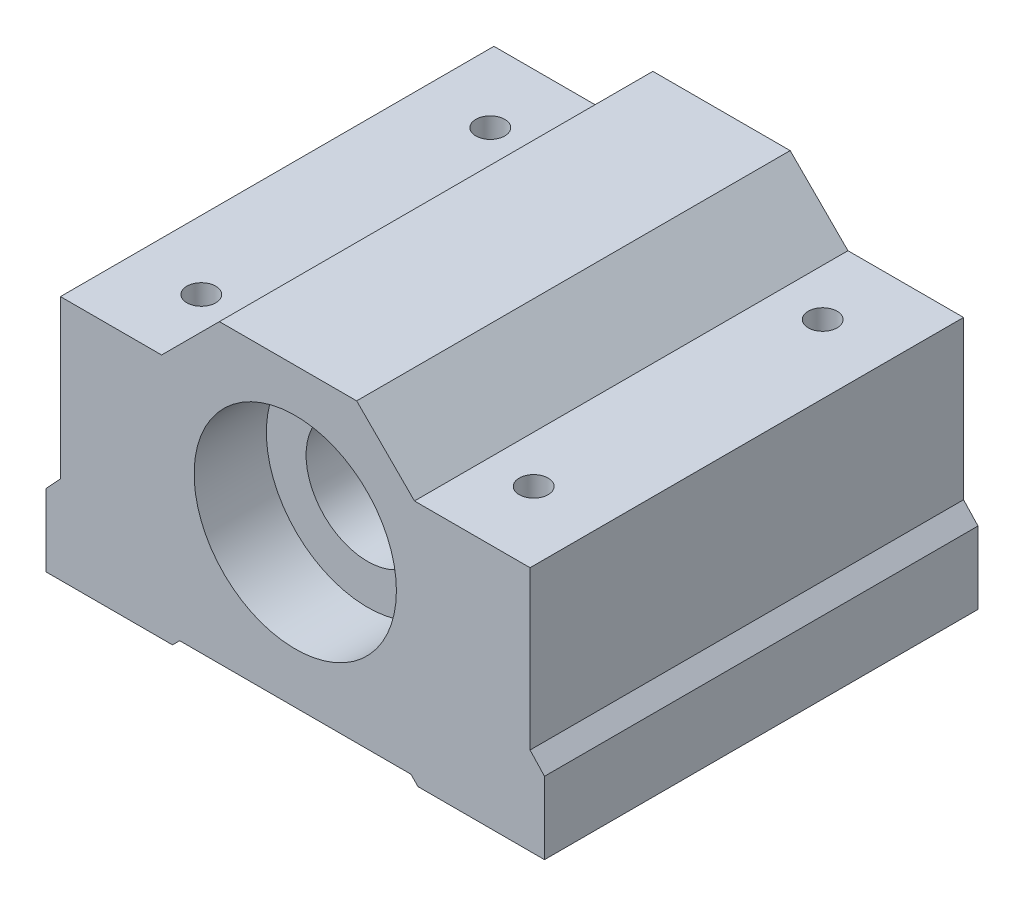
ISO-10303-21;
HEADER;
FILE_DESCRIPTION(('STEP AP214'),'2;1');
FILE_NAME('part.step','',(''),(''),'','','');
FILE_SCHEMA(('AUTOMOTIVE_DESIGN { 1 0 10303 214 1 1 1 1 }'));
ENDSEC;
DATA;
#1=APPLICATION_CONTEXT('core data for automotive mechanical design processes');
#2=APPLICATION_PROTOCOL_DEFINITION('international standard','automotive_design',2000,#1);
#3=PRODUCT_CONTEXT('',#1,'mechanical');
#4=PRODUCT('Part','Part','',(#3));
#5=PRODUCT_RELATED_PRODUCT_CATEGORY('part','',(#4));
#6=PRODUCT_DEFINITION_FORMATION('','',#4);
#7=PRODUCT_DEFINITION_CONTEXT('part definition',#1,'design');
#8=PRODUCT_DEFINITION('design','',#6,#7);
#9=PRODUCT_DEFINITION_SHAPE('','',#8);
#10=(LENGTH_UNIT() NAMED_UNIT(*) SI_UNIT(.MILLI.,.METRE.));
#11=(NAMED_UNIT(*) PLANE_ANGLE_UNIT() SI_UNIT($,.RADIAN.));
#12=(NAMED_UNIT(*) SI_UNIT($,.STERADIAN.) SOLID_ANGLE_UNIT());
#13=UNCERTAINTY_MEASURE_WITH_UNIT(LENGTH_MEASURE(1.E-05),#10,'distance_accuracy_value','');
#14=(GEOMETRIC_REPRESENTATION_CONTEXT(3) GLOBAL_UNCERTAINTY_ASSIGNED_CONTEXT((#13)) GLOBAL_UNIT_ASSIGNED_CONTEXT((#10,
#11,#12)) REPRESENTATION_CONTEXT('',''));
#15=CARTESIAN_POINT('',(0.,0.,0.));
#16=DIRECTION('',(0.,0.,1.));
#17=DIRECTION('',(1.,0.,0.));
#18=AXIS2_PLACEMENT_3D('',#15,#16,#17);
#19=CARTESIAN_POINT('',(0.,0.5,30.));
#20=DIRECTION('',(0.,0.,-1.));
#21=DIRECTION('',(-1.,0.,0.));
#22=AXIS2_PLACEMENT_3D('',#19,#20,#21);
#23=CYLINDRICAL_SURFACE('',#22,7.);
#24=CARTESIAN_POINT('',(0.,0.5,0.));
#25=DIRECTION('',(0.,0.,1.));
#26=DIRECTION('',(1.,0.,0.));
#27=AXIS2_PLACEMENT_3D('',#24,#25,#26);
#28=CIRCLE('',#27,7.);
#29=CARTESIAN_POINT('',(7.,0.5,0.));
#30=VERTEX_POINT('',#29);
#31=EDGE_CURVE('E211',#30,#30,#28,.T.);
#32=ORIENTED_EDGE('',*,*,#31,.F.);
#33=EDGE_LOOP('',(#32));
#34=FACE_BOUND('',#33,.T.);
#35=CARTESIAN_POINT('',(0.,0.5,5.));
#36=DIRECTION('',(0.,0.,1.));
#37=DIRECTION('',(1.,0.,0.));
#38=AXIS2_PLACEMENT_3D('',#35,#36,#37);
#39=CIRCLE('',#38,7.);
#40=CARTESIAN_POINT('',(7.,0.5,5.));
#41=VERTEX_POINT('',#40);
#42=EDGE_CURVE('E208',#41,#41,#39,.T.);
#43=ORIENTED_EDGE('',*,*,#42,.T.);
#44=EDGE_LOOP('',(#43));
#45=FACE_BOUND('',#44,.T.);
#46=ADVANCED_FACE('F52',(#34,#45),#23,.F.);
#47=CARTESIAN_POINT('',(-7.875,7.875,30.));
#48=DIRECTION('',(-0.707106781186547,0.707106781186548,0.));
#49=DIRECTION('',(-0.707106781186548,-0.707106781186547,0.));
#50=AXIS2_PLACEMENT_3D('',#47,#48,#49);
#51=PLANE('',#50);
#52=DIRECTION('',(0.707106781186548,0.707106781186547,0.));
#53=VECTOR('',#52,1.);
#54=CARTESIAN_POINT('',(-7.875,7.875,0.));
#55=LINE('',#54,#53);
#56=CARTESIAN_POINT('',(-9.25,6.5,0.));
#57=VERTEX_POINT('',#56);
#58=CARTESIAN_POINT('',(-5.25,10.5,0.));
#59=VERTEX_POINT('',#58);
#60=EDGE_CURVE('E329',#57,#59,#55,.T.);
#61=ORIENTED_EDGE('',*,*,#60,.F.);
#62=DIRECTION('',(0.,0.,-1.));
#63=VECTOR('',#62,1.);
#64=CARTESIAN_POINT('',(-9.25,6.5,30.));
#65=LINE('',#64,#63);
#66=CARTESIAN_POINT('',(-9.25,6.5,30.));
#67=VERTEX_POINT('',#66);
#68=EDGE_CURVE('E61',#67,#57,#65,.T.);
#69=ORIENTED_EDGE('',*,*,#68,.F.);
#70=DIRECTION('',(0.707106781186548,0.707106781186547,0.));
#71=VECTOR('',#70,1.);
#72=CARTESIAN_POINT('',(-7.875,7.875,30.));
#73=LINE('',#72,#71);
#74=CARTESIAN_POINT('',(-5.25,10.5,30.));
#75=VERTEX_POINT('',#74);
#76=EDGE_CURVE('E198',#67,#75,#73,.T.);
#77=ORIENTED_EDGE('',*,*,#76,.T.);
#78=DIRECTION('',(0.,0.,-1.));
#79=VECTOR('',#78,1.);
#80=CARTESIAN_POINT('',(-5.25,10.5,30.));
#81=LINE('',#80,#79);
#82=EDGE_CURVE('E69',#75,#59,#81,.T.);
#83=ORIENTED_EDGE('',*,*,#82,.T.);
#84=EDGE_LOOP('',(#61,#69,#77,#83));
#85=FACE_BOUND('',#84,.T.);
#86=ADVANCED_FACE('F330',(#85),#51,.T.);
#87=CARTESIAN_POINT('',(0.,6.5,30.));
#88=DIRECTION('',(0.,1.,0.));
#89=DIRECTION('',(0.,0.,1.));
#90=AXIS2_PLACEMENT_3D('',#87,#88,#89);
#91=PLANE('',#90);
#92=CARTESIAN_POINT('',(-11.5,6.5,25.));
#93=DIRECTION('',(0.,1.,0.));
#94=DIRECTION('',(0.,0.,1.));
#95=AXIS2_PLACEMENT_3D('',#92,#93,#94);
#96=CIRCLE('',#95,0.999999999999992);
#97=CARTESIAN_POINT('',(-11.5,6.5,26.));
#98=VERTEX_POINT('',#97);
#99=EDGE_CURVE('E236',#98,#98,#96,.T.);
#100=ORIENTED_EDGE('',*,*,#99,.F.);
#101=EDGE_LOOP('',(#100));
#102=FACE_BOUND('',#101,.T.);
#103=CARTESIAN_POINT('',(-11.5,6.5,5.));
#104=DIRECTION('',(0.,1.,0.));
#105=DIRECTION('',(0.,0.,1.));
#106=AXIS2_PLACEMENT_3D('',#103,#104,#105);
#107=CIRCLE('',#106,0.999999999999992);
#108=CARTESIAN_POINT('',(-11.5,6.5,5.99999999999999));
#109=VERTEX_POINT('',#108);
#110=EDGE_CURVE('E230',#109,#109,#107,.T.);
#111=ORIENTED_EDGE('',*,*,#110,.F.);
#112=EDGE_LOOP('',(#111));
#113=FACE_BOUND('',#112,.T.);
#114=DIRECTION('',(1.,0.,0.));
#115=VECTOR('',#114,1.);
#116=CARTESIAN_POINT('',(0.,6.5,0.));
#117=LINE('',#116,#115);
#118=CARTESIAN_POINT('',(-16.25,6.5,0.));
#119=VERTEX_POINT('',#118);
#120=EDGE_CURVE('E327',#119,#57,#117,.T.);
#121=ORIENTED_EDGE('',*,*,#120,.F.);
#122=DIRECTION('',(0.,0.,-1.));
#123=VECTOR('',#122,1.);
#124=CARTESIAN_POINT('',(-16.25,6.5,30.));
#125=LINE('',#124,#123);
#126=CARTESIAN_POINT('',(-16.25,6.5,30.));
#127=VERTEX_POINT('',#126);
#128=EDGE_CURVE('E323',#127,#119,#125,.T.);
#129=ORIENTED_EDGE('',*,*,#128,.F.);
#130=DIRECTION('',(1.,0.,0.));
#131=VECTOR('',#130,1.);
#132=CARTESIAN_POINT('',(0.,6.5,30.));
#133=LINE('',#132,#131);
#134=EDGE_CURVE('E191',#127,#67,#133,.T.);
#135=ORIENTED_EDGE('',*,*,#134,.T.);
#136=ORIENTED_EDGE('',*,*,#68,.T.);
#137=EDGE_LOOP('',(#121,#129,#135,#136));
#138=FACE_BOUND('',#137,.T.);
#139=ADVANCED_FACE('F325',(#102,#113,#138),#91,.T.);
#140=CARTESIAN_POINT('',(-16.25,0.,30.));
#141=DIRECTION('',(-1.,0.,0.));
#142=DIRECTION('',(0.,0.,1.));
#143=AXIS2_PLACEMENT_3D('',#140,#141,#142);
#144=PLANE('',#143);
#145=DIRECTION('',(0.,1.,0.));
#146=VECTOR('',#145,1.);
#147=CARTESIAN_POINT('',(-16.25,0.,0.));
#148=LINE('',#147,#146);
#149=CARTESIAN_POINT('',(-16.25,-4.42716608277603,0.));
#150=VERTEX_POINT('',#149);
#151=EDGE_CURVE('E334',#150,#119,#148,.T.);
#152=ORIENTED_EDGE('',*,*,#151,.F.);
#153=DIRECTION('',(0.,0.,-1.));
#154=VECTOR('',#153,1.);
#155=CARTESIAN_POINT('',(-16.25,-4.42716608277603,30.));
#156=LINE('',#155,#154);
#157=CARTESIAN_POINT('',(-16.25,-4.42716608277603,30.));
#158=VERTEX_POINT('',#157);
#159=EDGE_CURVE('E321',#158,#150,#156,.T.);
#160=ORIENTED_EDGE('',*,*,#159,.F.);
#161=DIRECTION('',(0.,1.,0.));
#162=VECTOR('',#161,1.);
#163=CARTESIAN_POINT('',(-16.25,0.,30.));
#164=LINE('',#163,#162);
#165=EDGE_CURVE('E197',#158,#127,#164,.T.);
#166=ORIENTED_EDGE('',*,*,#165,.T.);
#167=ORIENTED_EDGE('',*,*,#128,.T.);
#168=EDGE_LOOP('',(#152,#160,#166,#167));
#169=FACE_BOUND('',#168,.T.);
#170=ADVANCED_FACE('F397',(#169),#144,.T.);
#171=CARTESIAN_POINT('',(-6.48715420892313,6.0467460105186,30.));
#172=DIRECTION('',(-0.731501219705467,0.681840131973335,0.));
#173=DIRECTION('',(-0.681840131973335,-0.731501219705467,0.));
#174=AXIS2_PLACEMENT_3D('',#171,#172,#173);
#175=PLANE('',#174);
#176=DIRECTION('',(0.681840131973335,0.731501219705467,0.));
#177=VECTOR('',#176,1.);
#178=CARTESIAN_POINT('',(-6.48715420892313,6.0467460105186,0.));
#179=LINE('',#178,#177);
#180=CARTESIAN_POINT('',(-17.25,-5.5,0.));
#181=VERTEX_POINT('',#180);
#182=EDGE_CURVE('E336',#181,#150,#179,.T.);
#183=ORIENTED_EDGE('',*,*,#182,.F.);
#184=DIRECTION('',(0.,0.,-1.));
#185=VECTOR('',#184,1.);
#186=CARTESIAN_POINT('',(-17.25,-5.5,30.));
#187=LINE('',#186,#185);
#188=CARTESIAN_POINT('',(-17.25,-5.5,30.));
#189=VERTEX_POINT('',#188);
#190=EDGE_CURVE('E319',#189,#181,#187,.T.);
#191=ORIENTED_EDGE('',*,*,#190,.F.);
#192=DIRECTION('',(0.681840131973335,0.731501219705467,0.));
#193=VECTOR('',#192,1.);
#194=CARTESIAN_POINT('',(-6.48715420892313,6.0467460105186,30.));
#195=LINE('',#194,#193);
#196=EDGE_CURVE('E202',#189,#158,#195,.T.);
#197=ORIENTED_EDGE('',*,*,#196,.T.);
#198=ORIENTED_EDGE('',*,*,#159,.T.);
#199=EDGE_LOOP('',(#183,#191,#197,#198));
#200=FACE_BOUND('',#199,.T.);
#201=ADVANCED_FACE('F404',(#200),#175,.T.);
#202=CARTESIAN_POINT('',(-17.25,0.,30.));
#203=DIRECTION('',(-1.,0.,0.));
#204=DIRECTION('',(0.,-1.,0.));
#205=AXIS2_PLACEMENT_3D('',#202,#203,#204);
#206=PLANE('',#205);
#207=DIRECTION('',(0.,1.,0.));
#208=VECTOR('',#207,1.);
#209=CARTESIAN_POINT('',(-17.25,0.,0.));
#210=LINE('',#209,#208);
#211=CARTESIAN_POINT('',(-17.25,-10.5,0.));
#212=VERTEX_POINT('',#211);
#213=EDGE_CURVE('E266',#212,#181,#210,.T.);
#214=ORIENTED_EDGE('',*,*,#213,.F.);
#215=DIRECTION('',(0.,0.,-1.));
#216=VECTOR('',#215,1.);
#217=CARTESIAN_POINT('',(-17.25,-10.5,30.));
#218=LINE('',#217,#216);
#219=CARTESIAN_POINT('',(-17.25,-10.5,30.));
#220=VERTEX_POINT('',#219);
#221=EDGE_CURVE('E261',#220,#212,#218,.T.);
#222=ORIENTED_EDGE('',*,*,#221,.F.);
#223=DIRECTION('',(0.,1.,0.));
#224=VECTOR('',#223,1.);
#225=CARTESIAN_POINT('',(-17.25,0.,30.));
#226=LINE('',#225,#224);
#227=EDGE_CURVE('E457',#220,#189,#226,.T.);
#228=ORIENTED_EDGE('',*,*,#227,.T.);
#229=ORIENTED_EDGE('',*,*,#190,.T.);
#230=EDGE_LOOP('',(#214,#222,#228,#229));
#231=FACE_BOUND('',#230,.T.);
#232=ADVANCED_FACE('F249',(#231),#206,.T.);
#233=CARTESIAN_POINT('',(0.,-10.5,30.));
#234=DIRECTION('',(0.,1.,0.));
#235=DIRECTION('',(0.,0.,1.));
#236=AXIS2_PLACEMENT_3D('',#233,#234,#235);
#237=PLANE('',#236);
#238=CARTESIAN_POINT('',(-11.5,-10.5,25.));
#239=DIRECTION('',(0.,-1.,0.));
#240=DIRECTION('',(0.,0.,-1.));
#241=AXIS2_PLACEMENT_3D('',#238,#239,#240);
#242=CIRCLE('',#241,0.999999999999987);
#243=CARTESIAN_POINT('',(-11.5,-10.5,24.));
#244=VERTEX_POINT('',#243);
#245=EDGE_CURVE('E239',#244,#244,#242,.T.);
#246=ORIENTED_EDGE('',*,*,#245,.F.);
#247=EDGE_LOOP('',(#246));
#248=FACE_BOUND('',#247,.T.);
#249=CARTESIAN_POINT('',(-11.5,-10.5,5.));
#250=DIRECTION('',(0.,-1.,0.));
#251=DIRECTION('',(0.,0.,-1.));
#252=AXIS2_PLACEMENT_3D('',#249,#250,#251);
#253=CIRCLE('',#252,0.999999999999987);
#254=CARTESIAN_POINT('',(-11.5,-10.5,4.00000000000001));
#255=VERTEX_POINT('',#254);
#256=EDGE_CURVE('E233',#255,#255,#253,.T.);
#257=ORIENTED_EDGE('',*,*,#256,.F.);
#258=EDGE_LOOP('',(#257));
#259=FACE_BOUND('',#258,.T.);
#260=DIRECTION('',(1.,0.,0.));
#261=VECTOR('',#260,1.);
#262=CARTESIAN_POINT('',(0.,-10.5,0.));
#263=LINE('',#262,#261);
#264=CARTESIAN_POINT('',(-8.49999999999999,-10.5,0.));
#265=VERTEX_POINT('',#264);
#266=EDGE_CURVE('E256',#212,#265,#263,.T.);
#267=ORIENTED_EDGE('',*,*,#266,.T.);
#268=DIRECTION('',(0.,0.,-1.));
#269=VECTOR('',#268,1.);
#270=CARTESIAN_POINT('',(-8.49999999999999,-10.5,30.));
#271=LINE('',#270,#269);
#272=CARTESIAN_POINT('',(-8.49999999999999,-10.5,30.));
#273=VERTEX_POINT('',#272);
#274=EDGE_CURVE('E259',#273,#265,#271,.T.);
#275=ORIENTED_EDGE('',*,*,#274,.F.);
#276=DIRECTION('',(1.,0.,0.));
#277=VECTOR('',#276,1.);
#278=CARTESIAN_POINT('',(0.,-10.5,30.));
#279=LINE('',#278,#277);
#280=EDGE_CURVE('E459',#220,#273,#279,.T.);
#281=ORIENTED_EDGE('',*,*,#280,.F.);
#282=ORIENTED_EDGE('',*,*,#221,.T.);
#283=EDGE_LOOP('',(#267,#275,#281,#282));
#284=FACE_BOUND('',#283,.T.);
#285=ADVANCED_FACE('F245',(#248,#259,#284),#237,.F.);
#286=CARTESIAN_POINT('',(0.999999999999933,-0.999999999999916,30.));
#287=DIRECTION('',(0.707106781186554,-0.707106781186541,0.));
#288=DIRECTION('',(0.707106781186541,0.707106781186554,0.));
#289=AXIS2_PLACEMENT_3D('',#286,#287,#288);
#290=PLANE('',#289);
#291=DIRECTION('',(-0.707106781186541,-0.707106781186554,0.));
#292=VECTOR('',#291,1.);
#293=CARTESIAN_POINT('',(0.999999999999933,-0.999999999999916,0.));
#294=LINE('',#293,#292);
#295=CARTESIAN_POINT('',(-8.,-10.,0.));
#296=VERTEX_POINT('',#295);
#297=EDGE_CURVE('E265',#296,#265,#294,.T.);
#298=ORIENTED_EDGE('',*,*,#297,.F.);
#299=DIRECTION('',(0.,0.,-1.));
#300=VECTOR('',#299,1.);
#301=CARTESIAN_POINT('',(-8.,-10.,30.));
#302=LINE('',#301,#300);
#303=CARTESIAN_POINT('',(-8.,-10.,30.));
#304=VERTEX_POINT('',#303);
#305=EDGE_CURVE('E315',#304,#296,#302,.T.);
#306=ORIENTED_EDGE('',*,*,#305,.F.);
#307=DIRECTION('',(-0.707106781186541,-0.707106781186554,0.));
#308=VECTOR('',#307,1.);
#309=CARTESIAN_POINT('',(0.999999999999933,-0.999999999999916,30.));
#310=LINE('',#309,#308);
#311=EDGE_CURVE('E463',#304,#273,#310,.T.);
#312=ORIENTED_EDGE('',*,*,#311,.T.);
#313=ORIENTED_EDGE('',*,*,#274,.T.);
#314=EDGE_LOOP('',(#298,#306,#312,#313));
#315=FACE_BOUND('',#314,.T.);
#316=ADVANCED_FACE('F248',(#315),#290,.T.);
#317=CARTESIAN_POINT('',(0.,-10.,30.));
#318=DIRECTION('',(0.,-1.,0.));
#319=DIRECTION('',(1.,0.,0.));
#320=AXIS2_PLACEMENT_3D('',#317,#318,#319);
#321=PLANE('',#320);
#322=DIRECTION('',(-1.,0.,0.));
#323=VECTOR('',#322,1.);
#324=CARTESIAN_POINT('',(0.,-10.,0.));
#325=LINE('',#324,#323);
#326=CARTESIAN_POINT('',(8.,-10.,0.));
#327=VERTEX_POINT('',#326);
#328=EDGE_CURVE('E273',#327,#296,#325,.T.);
#329=ORIENTED_EDGE('',*,*,#328,.F.);
#330=DIRECTION('',(0.,0.,-1.));
#331=VECTOR('',#330,1.);
#332=CARTESIAN_POINT('',(8.,-10.,30.));
#333=LINE('',#332,#331);
#334=CARTESIAN_POINT('',(8.,-10.,30.));
#335=VERTEX_POINT('',#334);
#336=EDGE_CURVE('E313',#335,#327,#333,.T.);
#337=ORIENTED_EDGE('',*,*,#336,.F.);
#338=DIRECTION('',(-1.,0.,0.));
#339=VECTOR('',#338,1.);
#340=CARTESIAN_POINT('',(0.,-10.,30.));
#341=LINE('',#340,#339);
#342=EDGE_CURVE('E444',#335,#304,#341,.T.);
#343=ORIENTED_EDGE('',*,*,#342,.T.);
#344=ORIENTED_EDGE('',*,*,#305,.T.);
#345=EDGE_LOOP('',(#329,#337,#343,#344));
#346=FACE_BOUND('',#345,.T.);
#347=ADVANCED_FACE('F466',(#346),#321,.T.);
#348=CARTESIAN_POINT('',(-1.0000000000001,-1.00000000000012,30.));
#349=DIRECTION('',(0.707106781186539,0.707106781186556,0.));
#350=DIRECTION('',(-0.707106781186556,0.707106781186539,0.));
#351=AXIS2_PLACEMENT_3D('',#348,#349,#350);
#352=PLANE('',#351);
#353=DIRECTION('',(0.707106781186556,-0.707106781186539,0.));
#354=VECTOR('',#353,1.);
#355=CARTESIAN_POINT('',(-1.0000000000001,-1.00000000000012,0.));
#356=LINE('',#355,#354);
#357=CARTESIAN_POINT('',(8.50000000000001,-10.5,0.));
#358=VERTEX_POINT('',#357);
#359=EDGE_CURVE('E276',#327,#358,#356,.T.);
#360=ORIENTED_EDGE('',*,*,#359,.T.);
#361=DIRECTION('',(0.,0.,-1.));
#362=VECTOR('',#361,1.);
#363=CARTESIAN_POINT('',(8.50000000000001,-10.5,30.));
#364=LINE('',#363,#362);
#365=CARTESIAN_POINT('',(8.50000000000001,-10.5,30.));
#366=VERTEX_POINT('',#365);
#367=EDGE_CURVE('E310',#366,#358,#364,.T.);
#368=ORIENTED_EDGE('',*,*,#367,.F.);
#369=DIRECTION('',(0.707106781186556,-0.707106781186539,0.));
#370=VECTOR('',#369,1.);
#371=CARTESIAN_POINT('',(-1.0000000000001,-1.00000000000012,30.));
#372=LINE('',#371,#370);
#373=EDGE_CURVE('E442',#335,#366,#372,.T.);
#374=ORIENTED_EDGE('',*,*,#373,.F.);
#375=ORIENTED_EDGE('',*,*,#336,.T.);
#376=EDGE_LOOP('',(#360,#368,#374,#375));
#377=FACE_BOUND('',#376,.T.);
#378=ADVANCED_FACE('F427',(#377),#352,.F.);
#379=CARTESIAN_POINT('',(0.,-10.5,30.));
#380=DIRECTION('',(0.,1.,0.));
#381=DIRECTION('',(0.,0.,1.));
#382=AXIS2_PLACEMENT_3D('',#379,#380,#381);
#383=PLANE('',#382);
#384=CARTESIAN_POINT('',(11.5,-10.5,5.));
#385=DIRECTION('',(0.,-1.,0.));
#386=DIRECTION('',(0.,0.,-1.));
#387=AXIS2_PLACEMENT_3D('',#384,#385,#386);
#388=CIRCLE('',#387,0.999999999999987);
#389=CARTESIAN_POINT('',(11.5,-10.5,4.00000000000001));
#390=VERTEX_POINT('',#389);
#391=EDGE_CURVE('E227',#390,#390,#388,.T.);
#392=ORIENTED_EDGE('',*,*,#391,.F.);
#393=EDGE_LOOP('',(#392));
#394=FACE_BOUND('',#393,.T.);
#395=CARTESIAN_POINT('',(11.5,-10.5,25.));
#396=DIRECTION('',(0.,-1.,0.));
#397=DIRECTION('',(0.,0.,-1.));
#398=AXIS2_PLACEMENT_3D('',#395,#396,#397);
#399=CIRCLE('',#398,0.999999999999987);
#400=CARTESIAN_POINT('',(11.5,-10.5,24.));
#401=VERTEX_POINT('',#400);
#402=EDGE_CURVE('E221',#401,#401,#399,.T.);
#403=ORIENTED_EDGE('',*,*,#402,.F.);
#404=EDGE_LOOP('',(#403));
#405=FACE_BOUND('',#404,.T.);
#406=DIRECTION('',(1.,0.,0.));
#407=VECTOR('',#406,1.);
#408=CARTESIAN_POINT('',(0.,-10.5,0.));
#409=LINE('',#408,#407);
#410=CARTESIAN_POINT('',(17.25,-10.5,0.));
#411=VERTEX_POINT('',#410);
#412=EDGE_CURVE('E282',#358,#411,#409,.T.);
#413=ORIENTED_EDGE('',*,*,#412,.T.);
#414=DIRECTION('',(0.,0.,-1.));
#415=VECTOR('',#414,1.);
#416=CARTESIAN_POINT('',(17.25,-10.5,30.));
#417=LINE('',#416,#415);
#418=CARTESIAN_POINT('',(17.25,-10.5,30.));
#419=VERTEX_POINT('',#418);
#420=EDGE_CURVE('E307',#419,#411,#417,.T.);
#421=ORIENTED_EDGE('',*,*,#420,.F.);
#422=DIRECTION('',(1.,0.,0.));
#423=VECTOR('',#422,1.);
#424=CARTESIAN_POINT('',(0.,-10.5,30.));
#425=LINE('',#424,#423);
#426=EDGE_CURVE('E437',#366,#419,#425,.T.);
#427=ORIENTED_EDGE('',*,*,#426,.F.);
#428=ORIENTED_EDGE('',*,*,#367,.T.);
#429=EDGE_LOOP('',(#413,#421,#427,#428));
#430=FACE_BOUND('',#429,.T.);
#431=ADVANCED_FACE('F423',(#394,#405,#430),#383,.F.);
#432=CARTESIAN_POINT('',(17.25,0.,30.));
#433=DIRECTION('',(-1.,0.,0.));
#434=DIRECTION('',(0.,0.,1.));
#435=AXIS2_PLACEMENT_3D('',#432,#433,#434);
#436=PLANE('',#435);
#437=DIRECTION('',(0.,1.,0.));
#438=VECTOR('',#437,1.);
#439=CARTESIAN_POINT('',(17.25,0.,0.));
#440=LINE('',#439,#438);
#441=CARTESIAN_POINT('',(17.25,-5.5,0.));
#442=VERTEX_POINT('',#441);
#443=EDGE_CURVE('E285',#411,#442,#440,.T.);
#444=ORIENTED_EDGE('',*,*,#443,.T.);
#445=DIRECTION('',(0.,0.,-1.));
#446=VECTOR('',#445,1.);
#447=CARTESIAN_POINT('',(17.25,-5.5,30.));
#448=LINE('',#447,#446);
#449=CARTESIAN_POINT('',(17.25,-5.5,30.));
#450=VERTEX_POINT('',#449);
#451=EDGE_CURVE('E304',#450,#442,#448,.T.);
#452=ORIENTED_EDGE('',*,*,#451,.F.);
#453=DIRECTION('',(0.,1.,0.));
#454=VECTOR('',#453,1.);
#455=CARTESIAN_POINT('',(17.25,0.,30.));
#456=LINE('',#455,#454);
#457=EDGE_CURVE('E435',#419,#450,#456,.T.);
#458=ORIENTED_EDGE('',*,*,#457,.F.);
#459=ORIENTED_EDGE('',*,*,#420,.T.);
#460=EDGE_LOOP('',(#444,#452,#458,#459));
#461=FACE_BOUND('',#460,.T.);
#462=ADVANCED_FACE('F426',(#461),#436,.F.);
#463=CARTESIAN_POINT('',(6.48715420892313,6.0467460105186,30.));
#464=DIRECTION('',(-0.731501219705467,-0.681840131973335,0.));
#465=DIRECTION('',(0.681840131973335,-0.731501219705467,0.));
#466=AXIS2_PLACEMENT_3D('',#463,#464,#465);
#467=PLANE('',#466);
#468=DIRECTION('',(-0.681840131973335,0.731501219705467,0.));
#469=VECTOR('',#468,1.);
#470=CARTESIAN_POINT('',(6.48715420892313,6.0467460105186,0.));
#471=LINE('',#470,#469);
#472=CARTESIAN_POINT('',(16.25,-4.42716608277603,0.));
#473=VERTEX_POINT('',#472);
#474=EDGE_CURVE('E288',#442,#473,#471,.T.);
#475=ORIENTED_EDGE('',*,*,#474,.T.);
#476=DIRECTION('',(0.,0.,-1.));
#477=VECTOR('',#476,1.);
#478=CARTESIAN_POINT('',(16.25,-4.42716608277603,30.));
#479=LINE('',#478,#477);
#480=CARTESIAN_POINT('',(16.25,-4.42716608277603,30.));
#481=VERTEX_POINT('',#480);
#482=EDGE_CURVE('E301',#481,#473,#479,.T.);
#483=ORIENTED_EDGE('',*,*,#482,.F.);
#484=DIRECTION('',(-0.681840131973335,0.731501219705467,0.));
#485=VECTOR('',#484,1.);
#486=CARTESIAN_POINT('',(6.48715420892313,6.0467460105186,30.));
#487=LINE('',#486,#485);
#488=EDGE_CURVE('E192',#450,#481,#487,.T.);
#489=ORIENTED_EDGE('',*,*,#488,.F.);
#490=ORIENTED_EDGE('',*,*,#451,.T.);
#491=EDGE_LOOP('',(#475,#483,#489,#490));
#492=FACE_BOUND('',#491,.T.);
#493=ADVANCED_FACE('F415',(#492),#467,.F.);
#494=CARTESIAN_POINT('',(16.25,0.,30.));
#495=DIRECTION('',(-1.,0.,0.));
#496=DIRECTION('',(0.,0.,1.));
#497=AXIS2_PLACEMENT_3D('',#494,#495,#496);
#498=PLANE('',#497);
#499=DIRECTION('',(0.,1.,0.));
#500=VECTOR('',#499,1.);
#501=CARTESIAN_POINT('',(16.25,0.,0.));
#502=LINE('',#501,#500);
#503=CARTESIAN_POINT('',(16.25,6.5,0.));
#504=VERTEX_POINT('',#503);
#505=EDGE_CURVE('E291',#473,#504,#502,.T.);
#506=ORIENTED_EDGE('',*,*,#505,.T.);
#507=DIRECTION('',(0.,0.,-1.));
#508=VECTOR('',#507,1.);
#509=CARTESIAN_POINT('',(16.25,6.5,30.));
#510=LINE('',#509,#508);
#511=CARTESIAN_POINT('',(16.25,6.5,30.));
#512=VERTEX_POINT('',#511);
#513=EDGE_CURVE('E178',#512,#504,#510,.T.);
#514=ORIENTED_EDGE('',*,*,#513,.F.);
#515=DIRECTION('',(0.,1.,0.));
#516=VECTOR('',#515,1.);
#517=CARTESIAN_POINT('',(16.25,0.,30.));
#518=LINE('',#517,#516);
#519=EDGE_CURVE('E188',#481,#512,#518,.T.);
#520=ORIENTED_EDGE('',*,*,#519,.F.);
#521=ORIENTED_EDGE('',*,*,#482,.T.);
#522=EDGE_LOOP('',(#506,#514,#520,#521));
#523=FACE_BOUND('',#522,.T.);
#524=ADVANCED_FACE('F409',(#523),#498,.F.);
#525=CARTESIAN_POINT('',(11.5,6.5,5.));
#526=DIRECTION('',(0.,1.,0.));
#527=DIRECTION('',(0.,0.,1.));
#528=AXIS2_PLACEMENT_3D('',#525,#526,#527);
#529=CIRCLE('',#528,0.999999999999992);
#530=CARTESIAN_POINT('',(11.5,6.5,5.99999999999999));
#531=VERTEX_POINT('',#530);
#532=EDGE_CURVE('E224',#531,#531,#529,.T.);
#533=ORIENTED_EDGE('',*,*,#532,.F.);
#534=EDGE_LOOP('',(#533));
#535=FACE_BOUND('',#534,.T.);
#536=CARTESIAN_POINT('',(11.5,6.5,25.));
#537=DIRECTION('',(0.,1.,0.));
#538=DIRECTION('',(0.,0.,1.));
#539=AXIS2_PLACEMENT_3D('',#536,#537,#538);
#540=CIRCLE('',#539,0.999999999999992);
#541=CARTESIAN_POINT('',(11.5,6.5,26.));
#542=VERTEX_POINT('',#541);
#543=EDGE_CURVE('E216',#542,#542,#540,.T.);
#544=ORIENTED_EDGE('',*,*,#543,.F.);
#545=EDGE_LOOP('',(#544));
#546=FACE_BOUND('',#545,.T.);
#547=CARTESIAN_POINT('',(8.25,6.5,0.));
#548=VERTEX_POINT('',#547);
#549=EDGE_CURVE('E175',#548,#504,#117,.T.);
#550=ORIENTED_EDGE('',*,*,#549,.F.);
#551=DIRECTION('',(0.,0.,-1.));
#552=VECTOR('',#551,1.);
#553=CARTESIAN_POINT('',(8.25,6.5,30.));
#554=LINE('',#553,#552);
#555=CARTESIAN_POINT('',(8.25,6.5,30.));
#556=VERTEX_POINT('',#555);
#557=EDGE_CURVE('E169',#556,#548,#554,.T.);
#558=ORIENTED_EDGE('',*,*,#557,.F.);
#559=EDGE_CURVE('E173',#556,#512,#133,.T.);
#560=ORIENTED_EDGE('',*,*,#559,.T.);
#561=ORIENTED_EDGE('',*,*,#513,.T.);
#562=EDGE_LOOP('',(#550,#558,#560,#561));
#563=FACE_BOUND('',#562,.T.);
#564=ADVANCED_FACE('F171',(#535,#546,#563),#91,.T.);
#565=CARTESIAN_POINT('',(7.37499999999995,7.37500000000004,30.));
#566=DIRECTION('',(-0.707106781186543,-0.707106781186552,0.));
#567=DIRECTION('',(0.707106781186552,-0.707106781186543,0.));
#568=AXIS2_PLACEMENT_3D('',#565,#566,#567);
#569=PLANE('',#568);
#570=DIRECTION('',(-0.707106781186552,0.707106781186543,0.));
#571=VECTOR('',#570,1.);
#572=CARTESIAN_POINT('',(7.37499999999995,7.37500000000004,0.));
#573=LINE('',#572,#571);
#574=CARTESIAN_POINT('',(4.24999999999995,10.5,0.));
#575=VERTEX_POINT('',#574);
#576=EDGE_CURVE('E294',#548,#575,#573,.T.);
#577=ORIENTED_EDGE('',*,*,#576,.T.);
#578=DIRECTION('',(0.,0.,-1.));
#579=VECTOR('',#578,1.);
#580=CARTESIAN_POINT('',(4.24999999999995,10.5,30.));
#581=LINE('',#580,#579);
#582=CARTESIAN_POINT('',(4.24999999999995,10.5,30.));
#583=VERTEX_POINT('',#582);
#584=EDGE_CURVE('E120',#583,#575,#581,.T.);
#585=ORIENTED_EDGE('',*,*,#584,.F.);
#586=DIRECTION('',(-0.707106781186552,0.707106781186543,0.));
#587=VECTOR('',#586,1.);
#588=CARTESIAN_POINT('',(7.37499999999995,7.37500000000004,30.));
#589=LINE('',#588,#587);
#590=EDGE_CURVE('E180',#556,#583,#589,.T.);
#591=ORIENTED_EDGE('',*,*,#590,.F.);
#592=ORIENTED_EDGE('',*,*,#557,.T.);
#593=EDGE_LOOP('',(#577,#585,#591,#592));
#594=FACE_BOUND('',#593,.T.);
#595=ADVANCED_FACE('F181',(#594),#569,.F.);
#596=CARTESIAN_POINT('',(0.,0.5,25.));
#597=DIRECTION('',(0.,0.,1.));
#598=DIRECTION('',(1.,0.,0.));
#599=AXIS2_PLACEMENT_3D('',#596,#597,#598);
#600=CIRCLE('',#599,7.);
#601=CARTESIAN_POINT('',(7.,0.5,25.));
#602=VERTEX_POINT('',#601);
#603=EDGE_CURVE('E13',#602,#602,#600,.T.);
#604=ORIENTED_EDGE('',*,*,#603,.F.);
#605=EDGE_LOOP('',(#604));
#606=FACE_BOUND('',#605,.T.);
#607=CARTESIAN_POINT('',(0.,0.5,30.));
#608=DIRECTION('',(0.,0.,1.));
#609=DIRECTION('',(1.,0.,0.));
#610=AXIS2_PLACEMENT_3D('',#607,#608,#609);
#611=CIRCLE('',#610,7.);
#612=CARTESIAN_POINT('',(7.,0.5,30.));
#613=VERTEX_POINT('',#612);
#614=EDGE_CURVE('E203',#613,#613,#611,.T.);
#615=ORIENTED_EDGE('',*,*,#614,.T.);
#616=EDGE_LOOP('',(#615));
#617=FACE_BOUND('',#616,.T.);
#618=ADVANCED_FACE('F54',(#606,#617),#23,.F.);
#619=CARTESIAN_POINT('',(0.,10.5,30.));
#620=DIRECTION('',(0.,1.,0.));
#621=DIRECTION('',(-1.,0.,0.));
#622=AXIS2_PLACEMENT_3D('',#619,#620,#621);
#623=PLANE('',#622);
#624=DIRECTION('',(1.,0.,0.));
#625=VECTOR('',#624,1.);
#626=CARTESIAN_POINT('',(0.,10.5,0.));
#627=LINE('',#626,#625);
#628=EDGE_CURVE('E205',#59,#575,#627,.T.);
#629=ORIENTED_EDGE('',*,*,#628,.F.);
#630=ORIENTED_EDGE('',*,*,#82,.F.);
#631=DIRECTION('',(1.,0.,0.));
#632=VECTOR('',#631,1.);
#633=CARTESIAN_POINT('',(0.,10.5,30.));
#634=LINE('',#633,#632);
#635=EDGE_CURVE('E184',#75,#583,#634,.T.);
#636=ORIENTED_EDGE('',*,*,#635,.T.);
#637=ORIENTED_EDGE('',*,*,#584,.T.);
#638=EDGE_LOOP('',(#629,#630,#636,#637));
#639=FACE_BOUND('',#638,.T.);
#640=ADVANCED_FACE('F338',(#639),#623,.T.);
#641=CARTESIAN_POINT('',(0.,0.,30.));
#642=DIRECTION('',(0.,0.,1.));
#643=DIRECTION('',(1.,0.,0.));
#644=AXIS2_PLACEMENT_3D('',#641,#642,#643);
#645=PLANE('',#644);
#646=ORIENTED_EDGE('',*,*,#614,.F.);
#647=EDGE_LOOP('',(#646));
#648=FACE_BOUND('',#647,.T.);
#649=ORIENTED_EDGE('',*,*,#76,.F.);
#650=ORIENTED_EDGE('',*,*,#134,.F.);
#651=ORIENTED_EDGE('',*,*,#165,.F.);
#652=ORIENTED_EDGE('',*,*,#196,.F.);
#653=ORIENTED_EDGE('',*,*,#227,.F.);
#654=ORIENTED_EDGE('',*,*,#280,.T.);
#655=ORIENTED_EDGE('',*,*,#311,.F.);
#656=ORIENTED_EDGE('',*,*,#342,.F.);
#657=ORIENTED_EDGE('',*,*,#373,.T.);
#658=ORIENTED_EDGE('',*,*,#426,.T.);
#659=ORIENTED_EDGE('',*,*,#457,.T.);
#660=ORIENTED_EDGE('',*,*,#488,.T.);
#661=ORIENTED_EDGE('',*,*,#519,.T.);
#662=ORIENTED_EDGE('',*,*,#559,.F.);
#663=ORIENTED_EDGE('',*,*,#590,.T.);
#664=ORIENTED_EDGE('',*,*,#635,.F.);
#665=EDGE_LOOP('',(#649,#650,#651,#652,#653,#654,#655,#656,#657,#658,#659,#660,#661,#662,#663,#664));
#666=FACE_BOUND('',#665,.T.);
#667=ADVANCED_FACE('F186',(#648,#666),#645,.T.);
#668=CARTESIAN_POINT('',(0.,0.,0.));
#669=DIRECTION('',(0.,0.,1.));
#670=DIRECTION('',(1.,0.,0.));
#671=AXIS2_PLACEMENT_3D('',#668,#669,#670);
#672=PLANE('',#671);
#673=ORIENTED_EDGE('',*,*,#31,.T.);
#674=EDGE_LOOP('',(#673));
#675=FACE_BOUND('',#674,.T.);
#676=ORIENTED_EDGE('',*,*,#60,.T.);
#677=ORIENTED_EDGE('',*,*,#628,.T.);
#678=ORIENTED_EDGE('',*,*,#576,.F.);
#679=ORIENTED_EDGE('',*,*,#549,.T.);
#680=ORIENTED_EDGE('',*,*,#505,.F.);
#681=ORIENTED_EDGE('',*,*,#474,.F.);
#682=ORIENTED_EDGE('',*,*,#443,.F.);
#683=ORIENTED_EDGE('',*,*,#412,.F.);
#684=ORIENTED_EDGE('',*,*,#359,.F.);
#685=ORIENTED_EDGE('',*,*,#328,.T.);
#686=ORIENTED_EDGE('',*,*,#297,.T.);
#687=ORIENTED_EDGE('',*,*,#266,.F.);
#688=ORIENTED_EDGE('',*,*,#213,.T.);
#689=ORIENTED_EDGE('',*,*,#182,.T.);
#690=ORIENTED_EDGE('',*,*,#151,.T.);
#691=ORIENTED_EDGE('',*,*,#120,.T.);
#692=EDGE_LOOP('',(#676,#677,#678,#679,#680,#681,#682,#683,#684,#685,#686,#687,#688,#689,#690,#691));
#693=FACE_BOUND('',#692,.T.);
#694=ADVANCED_FACE('F270',(#675,#693),#672,.F.);
#695=CARTESIAN_POINT('',(0.,0.5,5.));
#696=DIRECTION('',(0.,0.,1.));
#697=DIRECTION('',(1.,0.,0.));
#698=AXIS2_PLACEMENT_3D('',#695,#696,#697);
#699=PLANE('',#698);
#700=CARTESIAN_POINT('',(0.,0.5,5.));
#701=DIRECTION('',(0.,0.,1.));
#702=DIRECTION('',(1.,0.,0.));
#703=AXIS2_PLACEMENT_3D('',#700,#701,#702);
#704=CIRCLE('',#703,4.25);
#705=CARTESIAN_POINT('',(4.25,0.5,5.));
#706=VERTEX_POINT('',#705);
#707=EDGE_CURVE('E212',#706,#706,#704,.T.);
#708=ORIENTED_EDGE('',*,*,#707,.T.);
#709=EDGE_LOOP('',(#708));
#710=FACE_BOUND('',#709,.T.);
#711=ORIENTED_EDGE('',*,*,#42,.F.);
#712=EDGE_LOOP('',(#711));
#713=FACE_BOUND('',#712,.T.);
#714=ADVANCED_FACE('F360',(#710,#713),#699,.F.);
#715=CARTESIAN_POINT('',(0.,0.5,25.));
#716=DIRECTION('',(0.,0.,1.));
#717=DIRECTION('',(1.,0.,0.));
#718=AXIS2_PLACEMENT_3D('',#715,#716,#717);
#719=PLANE('',#718);
#720=CARTESIAN_POINT('',(0.,0.5,25.));
#721=DIRECTION('',(0.,0.,1.));
#722=DIRECTION('',(1.,0.,0.));
#723=AXIS2_PLACEMENT_3D('',#720,#721,#722);
#724=CIRCLE('',#723,4.25);
#725=CARTESIAN_POINT('',(4.25,0.5,25.));
#726=VERTEX_POINT('',#725);
#727=EDGE_CURVE('E213',#726,#726,#724,.T.);
#728=ORIENTED_EDGE('',*,*,#727,.F.);
#729=EDGE_LOOP('',(#728));
#730=FACE_BOUND('',#729,.T.);
#731=ORIENTED_EDGE('',*,*,#603,.T.);
#732=EDGE_LOOP('',(#731));
#733=FACE_BOUND('',#732,.T.);
#734=ADVANCED_FACE('F362',(#730,#733),#719,.T.);
#735=CARTESIAN_POINT('',(0.,0.5,5.));
#736=DIRECTION('',(0.,0.,1.));
#737=DIRECTION('',(1.,0.,0.));
#738=AXIS2_PLACEMENT_3D('',#735,#736,#737);
#739=CYLINDRICAL_SURFACE('',#738,4.25);
#740=ORIENTED_EDGE('',*,*,#707,.F.);
#741=EDGE_LOOP('',(#740));
#742=FACE_BOUND('',#741,.T.);
#743=ORIENTED_EDGE('',*,*,#727,.T.);
#744=EDGE_LOOP('',(#743));
#745=FACE_BOUND('',#744,.T.);
#746=ADVANCED_FACE('F369',(#742,#745),#739,.F.);
#747=CARTESIAN_POINT('',(11.5,-10.5,25.));
#748=DIRECTION('',(0.,-1.,0.));
#749=DIRECTION('',(0.,0.,-1.));
#750=AXIS2_PLACEMENT_3D('',#747,#748,#749);
#751=CYLINDRICAL_SURFACE('',#750,0.999999999999992);
#752=ORIENTED_EDGE('',*,*,#543,.T.);
#753=EDGE_LOOP('',(#752));
#754=FACE_BOUND('',#753,.T.);
#755=ORIENTED_EDGE('',*,*,#402,.T.);
#756=EDGE_LOOP('',(#755));
#757=FACE_BOUND('',#756,.T.);
#758=ADVANCED_FACE('F376',(#754,#757),#751,.F.);
#759=CARTESIAN_POINT('',(11.5,-10.5,5.));
#760=DIRECTION('',(0.,-1.,0.));
#761=DIRECTION('',(0.,0.,-1.));
#762=AXIS2_PLACEMENT_3D('',#759,#760,#761);
#763=CYLINDRICAL_SURFACE('',#762,0.999999999999992);
#764=ORIENTED_EDGE('',*,*,#532,.T.);
#765=EDGE_LOOP('',(#764));
#766=FACE_BOUND('',#765,.T.);
#767=ORIENTED_EDGE('',*,*,#391,.T.);
#768=EDGE_LOOP('',(#767));
#769=FACE_BOUND('',#768,.T.);
#770=ADVANCED_FACE('F380',(#766,#769),#763,.F.);
#771=CARTESIAN_POINT('',(-11.5,-10.5,5.));
#772=DIRECTION('',(0.,-1.,0.));
#773=DIRECTION('',(0.,0.,-1.));
#774=AXIS2_PLACEMENT_3D('',#771,#772,#773);
#775=CYLINDRICAL_SURFACE('',#774,0.999999999999992);
#776=ORIENTED_EDGE('',*,*,#110,.T.);
#777=EDGE_LOOP('',(#776));
#778=FACE_BOUND('',#777,.T.);
#779=ORIENTED_EDGE('',*,*,#256,.T.);
#780=EDGE_LOOP('',(#779));
#781=FACE_BOUND('',#780,.T.);
#782=ADVANCED_FACE('F384',(#778,#781),#775,.F.);
#783=CARTESIAN_POINT('',(-11.5,-10.5,25.));
#784=DIRECTION('',(0.,-1.,0.));
#785=DIRECTION('',(0.,0.,-1.));
#786=AXIS2_PLACEMENT_3D('',#783,#784,#785);
#787=CYLINDRICAL_SURFACE('',#786,0.999999999999992);
#788=ORIENTED_EDGE('',*,*,#99,.T.);
#789=EDGE_LOOP('',(#788));
#790=FACE_BOUND('',#789,.T.);
#791=ORIENTED_EDGE('',*,*,#245,.T.);
#792=EDGE_LOOP('',(#791));
#793=FACE_BOUND('',#792,.T.);
#794=ADVANCED_FACE('F243',(#790,#793),#787,.F.);
#795=CLOSED_SHELL('',(#46,#86,#139,#170,#201,#232,#285,#316,#347,#378,#431,#462,#493,#524,#564,
#595,#618,#640,#667,#694,#714,#734,#746,#758,#770,#782,#794));
#796=MANIFOLD_SOLID_BREP('B2',#795);
#797=ADVANCED_BREP_SHAPE_REPRESENTATION('',(#18,#796),#14);
#798=SHAPE_DEFINITION_REPRESENTATION(#9,#797);
ENDSEC;
END-ISO-10303-21;
